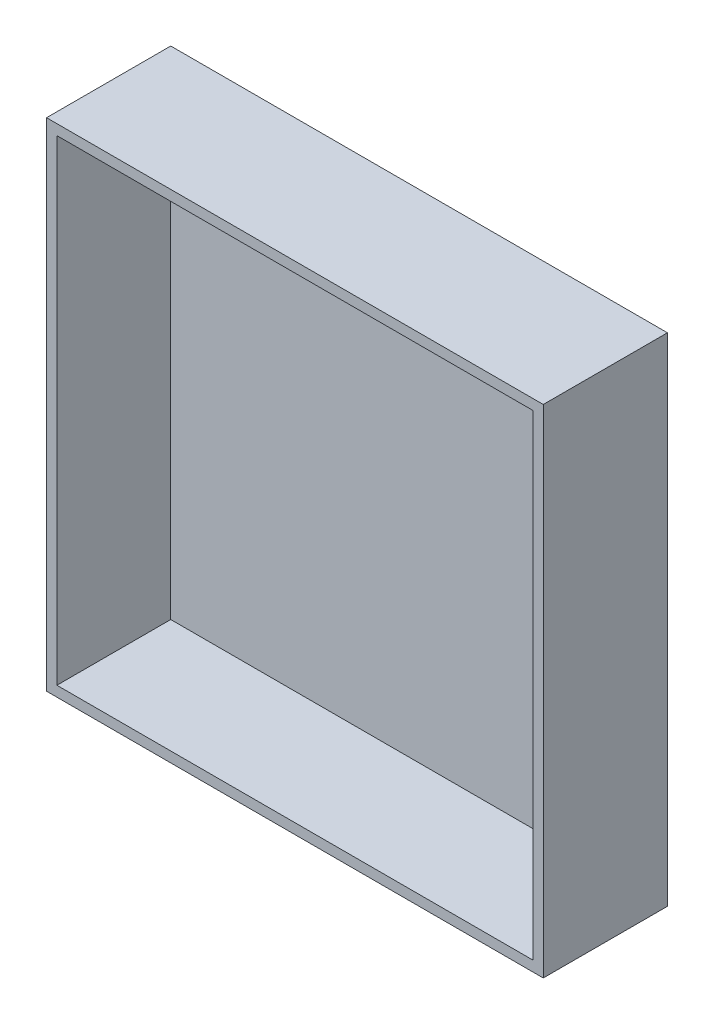
ISO-10303-21;
HEADER;
FILE_DESCRIPTION(('STEP AP214'),'2;1');
FILE_NAME('part.step','',(''),(''),'','','');
FILE_SCHEMA(('AUTOMOTIVE_DESIGN { 1 0 10303 214 1 1 1 1 }'));
ENDSEC;
DATA;
#1=APPLICATION_CONTEXT('core data for automotive mechanical design processes');
#2=APPLICATION_PROTOCOL_DEFINITION('international standard','automotive_design',2000,#1);
#3=PRODUCT_CONTEXT('',#1,'mechanical');
#4=PRODUCT('Part','Part','',(#3));
#5=PRODUCT_RELATED_PRODUCT_CATEGORY('part','',(#4));
#6=PRODUCT_DEFINITION_FORMATION('','',#4);
#7=PRODUCT_DEFINITION_CONTEXT('part definition',#1,'design');
#8=PRODUCT_DEFINITION('design','',#6,#7);
#9=PRODUCT_DEFINITION_SHAPE('','',#8);
#10=(LENGTH_UNIT() NAMED_UNIT(*) SI_UNIT(.MILLI.,.METRE.));
#11=(NAMED_UNIT(*) PLANE_ANGLE_UNIT() SI_UNIT($,.RADIAN.));
#12=(NAMED_UNIT(*) SI_UNIT($,.STERADIAN.) SOLID_ANGLE_UNIT());
#13=UNCERTAINTY_MEASURE_WITH_UNIT(LENGTH_MEASURE(1.E-05),#10,'distance_accuracy_value','');
#14=(GEOMETRIC_REPRESENTATION_CONTEXT(3) GLOBAL_UNCERTAINTY_ASSIGNED_CONTEXT((#13)) GLOBAL_UNIT_ASSIGNED_CONTEXT((#10,
#11,#12)) REPRESENTATION_CONTEXT('',''));
#15=CARTESIAN_POINT('',(0.,0.,0.));
#16=DIRECTION('',(0.,0.,1.));
#17=DIRECTION('',(1.,0.,0.));
#18=AXIS2_PLACEMENT_3D('',#15,#16,#17);
#19=CARTESIAN_POINT('',(0.,0.,60.));
#20=DIRECTION('',(1.,0.,0.));
#21=DIRECTION('',(0.,1.,0.));
#22=AXIS2_PLACEMENT_3D('',#19,#20,#21);
#23=PLANE('',#22);
#24=DIRECTION('',(0.,-1.,0.));
#25=VECTOR('',#24,1.);
#26=CARTESIAN_POINT('',(0.,0.,0.));
#27=LINE('',#26,#25);
#28=CARTESIAN_POINT('',(0.,0.,0.));
#29=VERTEX_POINT('',#28);
#30=CARTESIAN_POINT('',(0.,-240.,0.));
#31=VERTEX_POINT('',#30);
#32=EDGE_CURVE('E141',#29,#31,#27,.T.);
#33=ORIENTED_EDGE('',*,*,#32,.T.);
#34=DIRECTION('',(0.,0.,-1.));
#35=VECTOR('',#34,1.);
#36=CARTESIAN_POINT('',(0.,-240.,60.));
#37=LINE('',#36,#35);
#38=CARTESIAN_POINT('',(0.,-240.,60.));
#39=VERTEX_POINT('',#38);
#40=EDGE_CURVE('E11',#39,#31,#37,.T.);
#41=ORIENTED_EDGE('',*,*,#40,.F.);
#42=DIRECTION('',(0.,-1.,0.));
#43=VECTOR('',#42,1.);
#44=CARTESIAN_POINT('',(0.,0.,60.));
#45=LINE('',#44,#43);
#46=CARTESIAN_POINT('',(0.,0.,60.));
#47=VERTEX_POINT('',#46);
#48=EDGE_CURVE('E145',#47,#39,#45,.T.);
#49=ORIENTED_EDGE('',*,*,#48,.F.);
#50=DIRECTION('',(0.,0.,-1.));
#51=VECTOR('',#50,1.);
#52=CARTESIAN_POINT('',(0.,0.,60.));
#53=LINE('',#52,#51);
#54=EDGE_CURVE('E151',#47,#29,#53,.T.);
#55=ORIENTED_EDGE('',*,*,#54,.T.);
#56=EDGE_LOOP('',(#33,#41,#49,#55));
#57=FACE_BOUND('',#56,.T.);
#58=ADVANCED_FACE('F33',(#57),#23,.F.);
#59=CARTESIAN_POINT('',(0.,-240.,60.));
#60=DIRECTION('',(0.,1.,0.));
#61=DIRECTION('',(0.,0.,1.));
#62=AXIS2_PLACEMENT_3D('',#59,#60,#61);
#63=PLANE('',#62);
#64=DIRECTION('',(1.,0.,0.));
#65=VECTOR('',#64,1.);
#66=CARTESIAN_POINT('',(0.,-240.,0.));
#67=LINE('',#66,#65);
#68=CARTESIAN_POINT('',(240.,-240.,0.));
#69=VERTEX_POINT('',#68);
#70=EDGE_CURVE('E154',#31,#69,#67,.T.);
#71=ORIENTED_EDGE('',*,*,#70,.T.);
#72=DIRECTION('',(0.,0.,-1.));
#73=VECTOR('',#72,1.);
#74=CARTESIAN_POINT('',(240.,-240.,60.));
#75=LINE('',#74,#73);
#76=CARTESIAN_POINT('',(240.,-240.,60.));
#77=VERTEX_POINT('',#76);
#78=EDGE_CURVE('E40',#77,#69,#75,.T.);
#79=ORIENTED_EDGE('',*,*,#78,.F.);
#80=DIRECTION('',(1.,0.,0.));
#81=VECTOR('',#80,1.);
#82=CARTESIAN_POINT('',(0.,-240.,60.));
#83=LINE('',#82,#81);
#84=EDGE_CURVE('E84',#39,#77,#83,.T.);
#85=ORIENTED_EDGE('',*,*,#84,.F.);
#86=ORIENTED_EDGE('',*,*,#40,.T.);
#87=EDGE_LOOP('',(#71,#79,#85,#86));
#88=FACE_BOUND('',#87,.T.);
#89=ADVANCED_FACE('F183',(#88),#63,.F.);
#90=CARTESIAN_POINT('',(240.,0.,60.));
#91=DIRECTION('',(-1.,0.,0.));
#92=DIRECTION('',(0.,-1.,0.));
#93=AXIS2_PLACEMENT_3D('',#90,#91,#92);
#94=PLANE('',#93);
#95=DIRECTION('',(0.,1.,0.));
#96=VECTOR('',#95,1.);
#97=CARTESIAN_POINT('',(240.,0.,0.));
#98=LINE('',#97,#96);
#99=CARTESIAN_POINT('',(240.,0.,0.));
#100=VERTEX_POINT('',#99);
#101=EDGE_CURVE('E156',#69,#100,#98,.T.);
#102=ORIENTED_EDGE('',*,*,#101,.T.);
#103=DIRECTION('',(0.,0.,-1.));
#104=VECTOR('',#103,1.);
#105=CARTESIAN_POINT('',(240.,0.,60.));
#106=LINE('',#105,#104);
#107=CARTESIAN_POINT('',(240.,0.,60.));
#108=VERTEX_POINT('',#107);
#109=EDGE_CURVE('E160',#108,#100,#106,.T.);
#110=ORIENTED_EDGE('',*,*,#109,.F.);
#111=DIRECTION('',(0.,1.,0.));
#112=VECTOR('',#111,1.);
#113=CARTESIAN_POINT('',(240.,0.,60.));
#114=LINE('',#113,#112);
#115=EDGE_CURVE('E148',#77,#108,#114,.T.);
#116=ORIENTED_EDGE('',*,*,#115,.F.);
#117=ORIENTED_EDGE('',*,*,#78,.T.);
#118=EDGE_LOOP('',(#102,#110,#116,#117));
#119=FACE_BOUND('',#118,.T.);
#120=ADVANCED_FACE('F165',(#119),#94,.F.);
#121=CARTESIAN_POINT('',(0.,0.,60.));
#122=DIRECTION('',(0.,-1.,0.));
#123=DIRECTION('',(0.,0.,-1.));
#124=AXIS2_PLACEMENT_3D('',#121,#122,#123);
#125=PLANE('',#124);
#126=DIRECTION('',(-1.,0.,0.));
#127=VECTOR('',#126,1.);
#128=CARTESIAN_POINT('',(0.,0.,0.));
#129=LINE('',#128,#127);
#130=EDGE_CURVE('E77',#100,#29,#129,.T.);
#131=ORIENTED_EDGE('',*,*,#130,.T.);
#132=ORIENTED_EDGE('',*,*,#54,.F.);
#133=DIRECTION('',(-1.,0.,0.));
#134=VECTOR('',#133,1.);
#135=CARTESIAN_POINT('',(0.,0.,60.));
#136=LINE('',#135,#134);
#137=EDGE_CURVE('E56',#108,#47,#136,.T.);
#138=ORIENTED_EDGE('',*,*,#137,.F.);
#139=ORIENTED_EDGE('',*,*,#109,.T.);
#140=EDGE_LOOP('',(#131,#132,#138,#139));
#141=FACE_BOUND('',#140,.T.);
#142=ADVANCED_FACE('F173',(#141),#125,.F.);
#143=CARTESIAN_POINT('',(0.,0.,60.));
#144=DIRECTION('',(0.,0.,1.));
#145=DIRECTION('',(1.,0.,0.));
#146=AXIS2_PLACEMENT_3D('',#143,#144,#145);
#147=PLANE('',#146);
#148=DIRECTION('',(-1.,0.,0.));
#149=VECTOR('',#148,1.);
#150=CARTESIAN_POINT('',(235.,-5.,60.));
#151=LINE('',#150,#149);
#152=CARTESIAN_POINT('',(235.,-5.,60.));
#153=VERTEX_POINT('',#152);
#154=CARTESIAN_POINT('',(5.,-5.,60.));
#155=VERTEX_POINT('',#154);
#156=EDGE_CURVE('E47',#153,#155,#151,.T.);
#157=ORIENTED_EDGE('',*,*,#156,.F.);
#158=DIRECTION('',(0.,1.,0.));
#159=VECTOR('',#158,1.);
#160=CARTESIAN_POINT('',(235.,-235.,60.));
#161=LINE('',#160,#159);
#162=CARTESIAN_POINT('',(235.,-235.,60.));
#163=VERTEX_POINT('',#162);
#164=EDGE_CURVE('E126',#163,#153,#161,.T.);
#165=ORIENTED_EDGE('',*,*,#164,.F.);
#166=DIRECTION('',(1.,0.,0.));
#167=VECTOR('',#166,1.);
#168=CARTESIAN_POINT('',(5.00000000000003,-235.,60.));
#169=LINE('',#168,#167);
#170=CARTESIAN_POINT('',(5.00000000000003,-235.,60.));
#171=VERTEX_POINT('',#170);
#172=EDGE_CURVE('E129',#171,#163,#169,.T.);
#173=ORIENTED_EDGE('',*,*,#172,.F.);
#174=DIRECTION('',(0.,-1.,0.));
#175=VECTOR('',#174,1.);
#176=CARTESIAN_POINT('',(5.,-5.,60.));
#177=LINE('',#176,#175);
#178=EDGE_CURVE('E135',#155,#171,#177,.T.);
#179=ORIENTED_EDGE('',*,*,#178,.F.);
#180=EDGE_LOOP('',(#157,#165,#173,#179));
#181=FACE_BOUND('',#180,.T.);
#182=ORIENTED_EDGE('',*,*,#48,.T.);
#183=ORIENTED_EDGE('',*,*,#84,.T.);
#184=ORIENTED_EDGE('',*,*,#115,.T.);
#185=ORIENTED_EDGE('',*,*,#137,.T.);
#186=EDGE_LOOP('',(#182,#183,#184,#185));
#187=FACE_BOUND('',#186,.T.);
#188=ADVANCED_FACE('F175',(#181,#187),#147,.T.);
#189=CARTESIAN_POINT('',(0.,0.,0.));
#190=DIRECTION('',(0.,0.,1.));
#191=DIRECTION('',(1.,0.,0.));
#192=AXIS2_PLACEMENT_3D('',#189,#190,#191);
#193=PLANE('',#192);
#194=ORIENTED_EDGE('',*,*,#32,.F.);
#195=ORIENTED_EDGE('',*,*,#130,.F.);
#196=ORIENTED_EDGE('',*,*,#101,.F.);
#197=ORIENTED_EDGE('',*,*,#70,.F.);
#198=EDGE_LOOP('',(#194,#195,#196,#197));
#199=FACE_BOUND('',#198,.T.);
#200=ADVANCED_FACE('F169',(#199),#193,.F.);
#201=CARTESIAN_POINT('',(235.,-5.,5.));
#202=DIRECTION('',(0.,1.,0.));
#203=DIRECTION('',(0.,0.,1.));
#204=AXIS2_PLACEMENT_3D('',#201,#202,#203);
#205=PLANE('',#204);
#206=ORIENTED_EDGE('',*,*,#156,.T.);
#207=DIRECTION('',(0.,0.,1.));
#208=VECTOR('',#207,1.);
#209=CARTESIAN_POINT('',(5.,-5.,5.));
#210=LINE('',#209,#208);
#211=CARTESIAN_POINT('',(5.,-5.,5.));
#212=VERTEX_POINT('',#211);
#213=EDGE_CURVE('E104',#212,#155,#210,.T.);
#214=ORIENTED_EDGE('',*,*,#213,.F.);
#215=DIRECTION('',(-1.,0.,0.));
#216=VECTOR('',#215,1.);
#217=CARTESIAN_POINT('',(235.,-5.,5.));
#218=LINE('',#217,#216);
#219=CARTESIAN_POINT('',(235.,-5.,5.));
#220=VERTEX_POINT('',#219);
#221=EDGE_CURVE('E108',#220,#212,#218,.T.);
#222=ORIENTED_EDGE('',*,*,#221,.F.);
#223=DIRECTION('',(0.,0.,1.));
#224=VECTOR('',#223,1.);
#225=CARTESIAN_POINT('',(235.,-5.,5.));
#226=LINE('',#225,#224);
#227=EDGE_CURVE('E139',#220,#153,#226,.T.);
#228=ORIENTED_EDGE('',*,*,#227,.T.);
#229=EDGE_LOOP('',(#206,#214,#222,#228));
#230=FACE_BOUND('',#229,.T.);
#231=ADVANCED_FACE('F106',(#230),#205,.F.);
#232=CARTESIAN_POINT('',(235.,-235.,5.));
#233=DIRECTION('',(1.,0.,0.));
#234=DIRECTION('',(0.,1.,0.));
#235=AXIS2_PLACEMENT_3D('',#232,#233,#234);
#236=PLANE('',#235);
#237=ORIENTED_EDGE('',*,*,#164,.T.);
#238=ORIENTED_EDGE('',*,*,#227,.F.);
#239=DIRECTION('',(0.,1.,0.));
#240=VECTOR('',#239,1.);
#241=CARTESIAN_POINT('',(235.,-235.,5.));
#242=LINE('',#241,#240);
#243=CARTESIAN_POINT('',(235.,-235.,5.));
#244=VERTEX_POINT('',#243);
#245=EDGE_CURVE('E114',#244,#220,#242,.T.);
#246=ORIENTED_EDGE('',*,*,#245,.F.);
#247=DIRECTION('',(0.,0.,1.));
#248=VECTOR('',#247,1.);
#249=CARTESIAN_POINT('',(235.,-235.,5.));
#250=LINE('',#249,#248);
#251=EDGE_CURVE('E142',#244,#163,#250,.T.);
#252=ORIENTED_EDGE('',*,*,#251,.T.);
#253=EDGE_LOOP('',(#237,#238,#246,#252));
#254=FACE_BOUND('',#253,.T.);
#255=ADVANCED_FACE('F222',(#254),#236,.F.);
#256=CARTESIAN_POINT('',(5.00000000000003,-235.,5.));
#257=DIRECTION('',(0.,-1.,0.));
#258=DIRECTION('',(0.,0.,-1.));
#259=AXIS2_PLACEMENT_3D('',#256,#257,#258);
#260=PLANE('',#259);
#261=ORIENTED_EDGE('',*,*,#172,.T.);
#262=ORIENTED_EDGE('',*,*,#251,.F.);
#263=DIRECTION('',(1.,0.,0.));
#264=VECTOR('',#263,1.);
#265=CARTESIAN_POINT('',(5.00000000000003,-235.,5.));
#266=LINE('',#265,#264);
#267=CARTESIAN_POINT('',(5.00000000000003,-235.,5.));
#268=VERTEX_POINT('',#267);
#269=EDGE_CURVE('E122',#268,#244,#266,.T.);
#270=ORIENTED_EDGE('',*,*,#269,.F.);
#271=DIRECTION('',(0.,0.,1.));
#272=VECTOR('',#271,1.);
#273=CARTESIAN_POINT('',(5.00000000000003,-235.,5.));
#274=LINE('',#273,#272);
#275=EDGE_CURVE('E113',#268,#171,#274,.T.);
#276=ORIENTED_EDGE('',*,*,#275,.T.);
#277=EDGE_LOOP('',(#261,#262,#270,#276));
#278=FACE_BOUND('',#277,.T.);
#279=ADVANCED_FACE('F231',(#278),#260,.F.);
#280=CARTESIAN_POINT('',(5.,-5.,5.));
#281=DIRECTION('',(-1.,0.,0.));
#282=DIRECTION('',(0.,-1.,0.));
#283=AXIS2_PLACEMENT_3D('',#280,#281,#282);
#284=PLANE('',#283);
#285=ORIENTED_EDGE('',*,*,#178,.T.);
#286=ORIENTED_EDGE('',*,*,#275,.F.);
#287=DIRECTION('',(0.,-1.,0.));
#288=VECTOR('',#287,1.);
#289=CARTESIAN_POINT('',(5.,-5.,5.));
#290=LINE('',#289,#288);
#291=EDGE_CURVE('E117',#212,#268,#290,.T.);
#292=ORIENTED_EDGE('',*,*,#291,.F.);
#293=ORIENTED_EDGE('',*,*,#213,.T.);
#294=EDGE_LOOP('',(#285,#286,#292,#293));
#295=FACE_BOUND('',#294,.T.);
#296=ADVANCED_FACE('F118',(#295),#284,.F.);
#297=CARTESIAN_POINT('',(0.,0.,5.));
#298=DIRECTION('',(0.,0.,1.));
#299=DIRECTION('',(1.,0.,0.));
#300=AXIS2_PLACEMENT_3D('',#297,#298,#299);
#301=PLANE('',#300);
#302=ORIENTED_EDGE('',*,*,#221,.T.);
#303=ORIENTED_EDGE('',*,*,#291,.T.);
#304=ORIENTED_EDGE('',*,*,#269,.T.);
#305=ORIENTED_EDGE('',*,*,#245,.T.);
#306=EDGE_LOOP('',(#302,#303,#304,#305));
#307=FACE_BOUND('',#306,.T.);
#308=ADVANCED_FACE('F124',(#307),#301,.T.);
#309=CLOSED_SHELL('',(#58,#89,#120,#142,#188,#200,#231,#255,#279,#296,#308));
#310=MANIFOLD_SOLID_BREP('B2',#309);
#311=ADVANCED_BREP_SHAPE_REPRESENTATION('',(#18,#310),#14);
#312=SHAPE_DEFINITION_REPRESENTATION(#9,#311);
ENDSEC;
END-ISO-10303-21;
